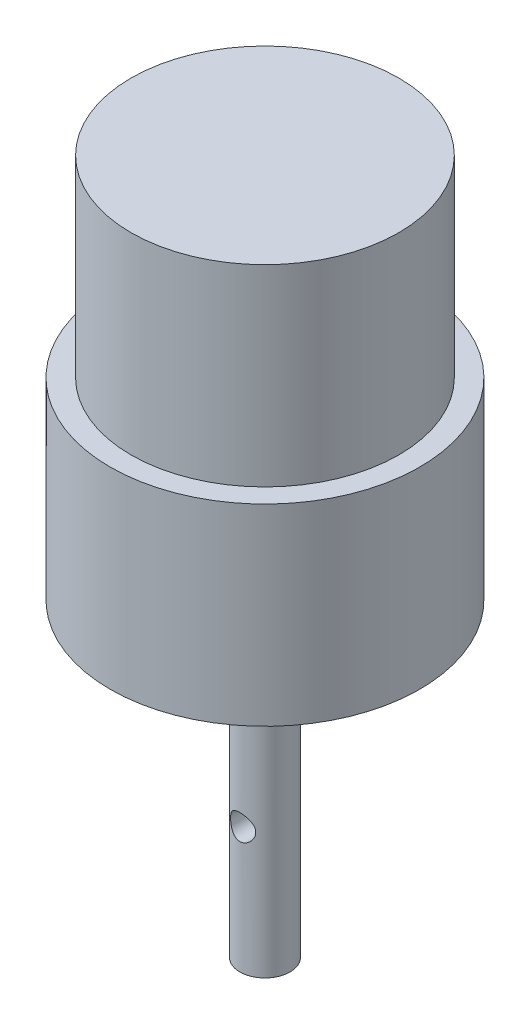
ISO-10303-21;
HEADER;
FILE_DESCRIPTION(('STEP AP214'),'2;1');
FILE_NAME('part.step','',(''),(''),'','','');
FILE_SCHEMA(('AUTOMOTIVE_DESIGN { 1 0 10303 214 1 1 1 1 }'));
ENDSEC;
DATA;
#1=APPLICATION_CONTEXT('core data for automotive mechanical design processes');
#2=APPLICATION_PROTOCOL_DEFINITION('international standard','automotive_design',2000,#1);
#3=PRODUCT_CONTEXT('',#1,'mechanical');
#4=PRODUCT('Part','Part','',(#3));
#5=PRODUCT_RELATED_PRODUCT_CATEGORY('part','',(#4));
#6=PRODUCT_DEFINITION_FORMATION('','',#4);
#7=PRODUCT_DEFINITION_CONTEXT('part definition',#1,'design');
#8=PRODUCT_DEFINITION('design','',#6,#7);
#9=PRODUCT_DEFINITION_SHAPE('','',#8);
#10=(LENGTH_UNIT() NAMED_UNIT(*) SI_UNIT(.MILLI.,.METRE.));
#11=(NAMED_UNIT(*) PLANE_ANGLE_UNIT() SI_UNIT($,.RADIAN.));
#12=(NAMED_UNIT(*) SI_UNIT($,.STERADIAN.) SOLID_ANGLE_UNIT());
#13=UNCERTAINTY_MEASURE_WITH_UNIT(LENGTH_MEASURE(1.E-05),#10,'distance_accuracy_value','');
#14=(GEOMETRIC_REPRESENTATION_CONTEXT(3) GLOBAL_UNCERTAINTY_ASSIGNED_CONTEXT((#13)) GLOBAL_UNIT_ASSIGNED_CONTEXT((#10,
#11,#12)) REPRESENTATION_CONTEXT('',''));
#15=CARTESIAN_POINT('',(0.,0.,0.));
#16=DIRECTION('',(0.,0.,1.));
#17=DIRECTION('',(1.,0.,0.));
#18=AXIS2_PLACEMENT_3D('',#15,#16,#17);
#19=CARTESIAN_POINT('',(0.,-37.,0.));
#20=DIRECTION('',(0.,1.,0.));
#21=DIRECTION('',(0.,0.,1.));
#22=AXIS2_PLACEMENT_3D('',#19,#20,#21);
#23=CYLINDRICAL_SURFACE('',#22,3.);
#24=CARTESIAN_POINT('',(-1.5,-22.,-2.59807621135332));
#25=CARTESIAN_POINT('',(-1.4999945446118,-22.0781617122929,-2.59808302092689));
#26=CARTESIAN_POINT('',(-1.49384995609983,-22.1564221172876,-2.60165701781635));
#27=CARTESIAN_POINT('',(-1.46958481484708,-22.3105408970157,-2.61543549678078));
#28=CARTESIAN_POINT('',(-1.45143909683127,-22.3863938725651,-2.62565391083339));
#29=CARTESIAN_POINT('',(-1.40414992304972,-22.5331774965159,-2.65124019908097));
#30=CARTESIAN_POINT('',(-1.3750649287406,-22.6041319787104,-2.66658065209878));
#31=CARTESIAN_POINT('',(-1.30690128806456,-22.7401363029951,-2.70063997225287));
#32=CARTESIAN_POINT('',(-1.26782210105366,-22.8051858253937,-2.71935902214097));
#33=CARTESIAN_POINT('',(-1.17699981079632,-22.9334585928363,-2.75995303586162));
#34=CARTESIAN_POINT('',(-1.12447805421566,-22.9960887035103,-2.7819609545693));
#35=CARTESIAN_POINT('',(-1.0098807114217,-23.1121125826101,-2.82557974178558));
#36=CARTESIAN_POINT('',(-0.947800388673441,-23.1655017438753,-2.84719040746875));
#37=CARTESIAN_POINT('',(-0.81073434512182,-23.2650507267215,-2.88932215429423));
#38=CARTESIAN_POINT('',(-0.735160783518862,-23.3104806517893,-2.90967159627259));
#39=CARTESIAN_POINT('',(-0.576235539899256,-23.3877112798686,-2.94526134149293));
#40=CARTESIAN_POINT('',(-0.492888807207233,-23.4195205842058,-2.96050486775612));
#41=CARTESIAN_POINT('',(-0.327067415888966,-23.4662569919516,-2.98320691866356));
#42=CARTESIAN_POINT('',(-0.244952685733226,-23.4822242895333,-2.99114220331338));
#43=CARTESIAN_POINT('',(-0.078855943046772,-23.5002491780126,-3.000113757691));
#44=CARTESIAN_POINT('',(0.00512490876560793,-23.5023151851936,-3.00115420176885));
#45=CARTESIAN_POINT('',(0.164748786635625,-23.4928799890445,-2.99644472874675));
#46=CARTESIAN_POINT('',(0.240481798765187,-23.4825429767182,-2.99127743838241));
#47=CARTESIAN_POINT('',(0.388970657877482,-23.450678734143,-2.97561367889621));
#48=CARTESIAN_POINT('',(0.461726281640888,-23.4291506665357,-2.96511681099591));
#49=CARTESIAN_POINT('',(0.603464087354331,-23.3753761508653,-2.93957374931482));
#50=CARTESIAN_POINT('',(0.672380135272769,-23.3429855302419,-2.92446662293799));
#51=CARTESIAN_POINT('',(0.803965202269994,-23.2686048756978,-2.89106468980031));
#52=CARTESIAN_POINT('',(0.866631973257969,-23.2266114050465,-2.87276874236226));
#53=CARTESIAN_POINT('',(0.990260491347293,-23.1296569727005,-2.83266591598844));
#54=CARTESIAN_POINT('',(1.05050111254404,-23.073845457511,-2.81069063997263));
#55=CARTESIAN_POINT('',(1.16115655544667,-22.9531154126047,-2.76681510880217));
#56=CARTESIAN_POINT('',(1.21156381736135,-22.8881899415889,-2.74491492398443));
#57=CARTESIAN_POINT('',(1.30425800196332,-22.7460277113639,-2.70216234138727));
#58=CARTESIAN_POINT('',(1.34582597246708,-22.6682709654187,-2.68146479986061));
#59=CARTESIAN_POINT('',(1.41497866950185,-22.5055934929615,-2.64563175417864));
#60=CARTESIAN_POINT('',(1.44257798731634,-22.4206803504737,-2.63049045069101));
#61=CARTESIAN_POINT('',(1.48077031653756,-22.2531782330758,-2.60916953725551));
#62=CARTESIAN_POINT('',(1.49253768317996,-22.1709383214347,-2.60237483772744));
#63=CARTESIAN_POINT('',(1.50227541991714,-22.0053979877252,-2.59676879042414));
#64=CARTESIAN_POINT('',(1.50025553597254,-21.9220983563203,-2.59795180333967));
#65=CARTESIAN_POINT('',(1.48355406501595,-21.7665191221319,-2.60751504810877));
#66=CARTESIAN_POINT('',(1.4702817250687,-21.6940308233381,-2.61509381259981));
#67=CARTESIAN_POINT('',(1.43354442694866,-21.5524483205936,-2.63541032327011));
#68=CARTESIAN_POINT('',(1.41007616793542,-21.4833552238801,-2.6481497400755));
#69=CARTESIAN_POINT('',(1.35247138290733,-21.346883003646,-2.67804333119485));
#70=CARTESIAN_POINT('',(1.31789109553909,-21.2797314747197,-2.69537464864595));
#71=CARTESIAN_POINT('',(1.23943059602371,-21.1517960926915,-2.73234179245874));
#72=CARTESIAN_POINT('',(1.19554560649833,-21.0910155347301,-2.75197880032721));
#73=CARTESIAN_POINT('',(1.09325575079828,-20.9695318487147,-2.79431997684504));
#74=CARTESIAN_POINT('',(1.03371790847245,-20.9098042739235,-2.81709874731433));
#75=CARTESIAN_POINT('',(0.905106743097437,-20.8008816430096,-2.86101352466838));
#76=CARTESIAN_POINT('',(0.836030211983024,-20.7516901446542,-2.88214897511564));
#77=CARTESIAN_POINT('',(0.687803043838138,-20.6641394110748,-2.92112042536435));
#78=CARTESIAN_POINT('',(0.608434646361172,-20.6261003226836,-2.93885462508044));
#79=CARTESIAN_POINT('',(0.443283546961624,-20.5642931442139,-2.96825032438951));
#80=CARTESIAN_POINT('',(0.357506552088264,-20.5405125229505,-2.97991715514559));
#81=CARTESIAN_POINT('',(0.190469523495625,-20.509947153738,-2.99501262272824));
#82=CARTESIAN_POINT('',(0.109517165775685,-20.5018031861858,-2.99909891862287));
#83=CARTESIAN_POINT('',(-0.0526889789268059,-20.4987351018184,-3.00063195562697));
#84=CARTESIAN_POINT('',(-0.133942650442631,-20.5038063572147,-2.99808102100335));
#85=CARTESIAN_POINT('',(-0.288806988475721,-20.5261246101934,-2.98700953256884));
#86=CARTESIAN_POINT('',(-0.362568476716895,-20.5425472738865,-2.97889342001985));
#87=CARTESIAN_POINT('',(-0.506168928275426,-20.5859904989545,-2.95788140495135));
#88=CARTESIAN_POINT('',(-0.576007327433263,-20.6130125801402,-2.94498481699193));
#89=CARTESIAN_POINT('',(-0.713135109367328,-20.678090578249,-2.9148889612218));
#90=CARTESIAN_POINT('',(-0.780187714050071,-20.7165689848118,-2.89752925798198));
#91=CARTESIAN_POINT('',(-0.907161962721039,-20.8029368962886,-2.86032199712739));
#92=CARTESIAN_POINT('',(-0.967080311122361,-20.8508307236735,-2.84047329837541));
#93=CARTESIAN_POINT('',(-1.08437100623534,-20.9601957085341,-2.79792915339941));
#94=CARTESIAN_POINT('',(-1.14089652680891,-21.0225437312158,-2.77514698517547));
#95=CARTESIAN_POINT('',(-1.24299493109201,-21.1561760816947,-2.73094614244278));
#96=CARTESIAN_POINT('',(-1.28855812501509,-21.2274682313015,-2.70952868642798));
#97=CARTESIAN_POINT('',(-1.36864661967848,-21.3799549698714,-2.66999407957374));
#98=CARTESIAN_POINT('',(-1.40277759894141,-21.4613912966931,-2.65200261384405));
#99=CARTESIAN_POINT('',(-1.45631806425962,-21.6299986065097,-2.62299234492527));
#100=CARTESIAN_POINT('',(-1.47577678676302,-21.717149333369,-2.61195024221553));
#101=CARTESIAN_POINT('',(-1.49155051179662,-21.837708033478,-2.60293908902686));
#102=CARTESIAN_POINT('',(-1.49471415744578,-21.8700518415968,-2.60112193507727));
#103=CARTESIAN_POINT('',(-1.49894010763495,-21.9349247210234,-2.59868903831625));
#104=CARTESIAN_POINT('',(-1.50000227159981,-21.9674538045788,-2.59807337587664));
#105=CARTESIAN_POINT('',(-1.5,-22.,-2.59807621135332));
#106=B_SPLINE_CURVE_WITH_KNOTS('',3,(#24,#25,#26,#27,#28,#29,#30,#31,#32,#33,#34,#35,#36,#37,
#38,#39,#40,#41,#42,#43,#44,#45,#46,#47,#48,#49,#50,#51,#52,#53,#54,#55,#56,#57,#58,#59,#60,#61,
#62,#63,#64,#65,#66,#67,#68,#69,#70,#71,#72,#73,#74,#75,#76,#77,#78,#79,#80,#81,#82,#83,#84,#85,
#86,#87,#88,#89,#90,#91,#92,#93,#94,#95,#96,#97,#98,#99,#100,#101,#102,#103,#104,#105),
.UNSPECIFIED.,.T.,.F.,(4,2,2,2,2,2,2,2,2,2,2,2,2,2,2,2,2,2,2,2,2,2,2,2,2,2,2,2,2,2,2,2,2,2,2,2,
2,2,2,2,4),(0.,0.234348183892075,0.469189339237207,0.702792893878324,0.936409088167727,
1.18929346874735,1.44230356626557,1.71236838358145,1.98226240445837,2.23295227451903,
2.4834903552906,2.71224146226808,2.94100968776183,3.1729430209672,3.40495949025408,
3.65890787185336,3.91305072368878,4.18333262594173,4.45333161317557,4.70193436281318,
4.9503613978256,5.17161275136038,5.39293578654095,5.62450944609132,5.85620229330071,
6.1171011537092,6.37808797467304,6.64596272119449,6.91360169713158,7.15668405584231,
7.39968130190958,7.62666637307239,7.8536840026802,8.09041126079209,8.32724745151079,
8.58765362775102,8.84828914267732,9.11716123557908,9.38512699504141,9.48270202777965,
9.58028358741812),.UNSPECIFIED.);
#107=CARTESIAN_POINT('',(-1.5,-22.,-2.59807621135332));
#108=VERTEX_POINT('',#107);
#109=EDGE_CURVE('E55',#108,#108,#106,.T.);
#110=ORIENTED_EDGE('',*,*,#109,.T.);
#111=EDGE_LOOP('',(#110));
#112=FACE_BOUND('',#111,.T.);
#113=CARTESIAN_POINT('',(0.,-8.,0.));
#114=DIRECTION('',(0.,-1.,0.));
#115=DIRECTION('',(0.,0.,-1.));
#116=AXIS2_PLACEMENT_3D('',#113,#114,#115);
#117=CIRCLE('',#116,3.);
#118=CARTESIAN_POINT('',(0.,-8.,-3.));
#119=VERTEX_POINT('',#118);
#120=EDGE_CURVE('E10',#119,#119,#117,.T.);
#121=ORIENTED_EDGE('',*,*,#120,.T.);
#122=EDGE_LOOP('',(#121));
#123=FACE_BOUND('',#122,.T.);
#124=CARTESIAN_POINT('',(0.,-37.,0.));
#125=DIRECTION('',(0.,1.,0.));
#126=DIRECTION('',(0.,0.,1.));
#127=AXIS2_PLACEMENT_3D('',#124,#125,#126);
#128=CIRCLE('',#127,3.);
#129=CARTESIAN_POINT('',(0.,-37.,3.));
#130=VERTEX_POINT('',#129);
#131=EDGE_CURVE('E89',#130,#130,#128,.T.);
#132=ORIENTED_EDGE('',*,*,#131,.T.);
#133=EDGE_LOOP('',(#132));
#134=FACE_BOUND('',#133,.T.);
#135=CARTESIAN_POINT('',(0.,-23.5,3.));
#136=CARTESIAN_POINT('',(-0.0788579444268502,-23.4999950465242,2.99999570107562));
#137=CARTESIAN_POINT('',(-0.157809899546344,-23.4937448903184,2.99685736529634));
#138=CARTESIAN_POINT('',(-0.313380352903345,-23.4690206794877,2.98461234055735));
#139=CARTESIAN_POINT('',(-0.389994130070445,-23.4505234105033,2.97549431743379));
#140=CARTESIAN_POINT('',(-0.538400317320674,-23.4022092870751,2.95224419105063));
#141=CARTESIAN_POINT('',(-0.61021020440872,-23.372436423628,2.93813158766306));
#142=CARTESIAN_POINT('',(-0.747708925209898,-23.3026440679525,2.90618664773642));
#143=CARTESIAN_POINT('',(-0.813398240985089,-23.2626253836267,2.88835460450288));
#144=CARTESIAN_POINT('',(-0.941261726642864,-23.1707241257721,2.84934387387093));
#145=CARTESIAN_POINT('',(-1.00298281668316,-23.1182702811405,2.82802798691306));
#146=CARTESIAN_POINT('',(-1.11716916730047,-23.0042177811295,2.78489955370114));
#147=CARTESIAN_POINT('',(-1.16962737466015,-22.9426122223413,2.76308664313552));
#148=CARTESIAN_POINT('',(-1.26787800067542,-22.8062749757149,2.71948426796021));
#149=CARTESIAN_POINT('',(-1.31283800332746,-22.7308958524811,2.69782780455198));
#150=CARTESIAN_POINT('',(-1.38925234033605,-22.5724489960207,2.65928968158481));
#151=CARTESIAN_POINT('',(-1.4207163224495,-22.4893868069159,2.64240461410484));
#152=CARTESIAN_POINT('',(-1.46719866328288,-22.3230023418671,2.61686800556713));
#153=CARTESIAN_POINT('',(-1.48308878562066,-22.2399933218989,2.6077840737557));
#154=CARTESIAN_POINT('',(-1.50064048996327,-22.0720317433308,2.59772834922791));
#155=CARTESIAN_POINT('',(-1.50231613255961,-21.9870811886933,2.59674854014932));
#156=CARTESIAN_POINT('',(-1.49203093075844,-21.8285709635269,2.60266395385873));
#157=CARTESIAN_POINT('',(-1.48167683930523,-21.7548639531654,2.6086314549302));
#158=CARTESIAN_POINT('',(-1.4504097735854,-21.6104171359404,2.62614343100775));
#159=CARTESIAN_POINT('',(-1.42949343584648,-21.539678282042,2.63768968247664));
#160=CARTESIAN_POINT('',(-1.37731467057901,-21.4011563011515,2.66531214619111));
#161=CARTESIAN_POINT('',(-1.34582260067399,-21.3334804018213,2.68148760995998));
#162=CARTESIAN_POINT('',(-1.273562531502,-21.204048561115,2.71655106422105));
#163=CARTESIAN_POINT('',(-1.2327903657187,-21.1422952965999,2.73544027170286));
#164=CARTESIAN_POINT('',(-1.13709908236918,-21.0182181208852,2.77669736854929));
#165=CARTESIAN_POINT('',(-1.08104168755392,-20.9568146896358,2.79920265355119));
#166=CARTESIAN_POINT('',(-0.959333368112059,-20.8438968721136,2.84321434950611));
#167=CARTESIAN_POINT('',(-0.893677884861427,-20.7923872119492,2.86472027938201));
#168=CARTESIAN_POINT('',(-0.750774758747771,-20.6984715084554,2.90552980924446));
#169=CARTESIAN_POINT('',(-0.673130387399112,-20.6565992913314,2.92468476243011));
#170=CARTESIAN_POINT('',(-0.510699323233194,-20.5868544564355,2.95736821681863));
#171=CARTESIAN_POINT('',(-0.425918364397914,-20.5589707224773,2.9709011841533));
#172=CARTESIAN_POINT('',(-0.259149737491054,-20.520286894425,2.98986500612153));
#173=CARTESIAN_POINT('',(-0.17751229582249,-20.5082631463798,2.99587407451965));
#174=CARTESIAN_POINT('',(-0.0131693999240276,-20.4978029032983,3.00109520188655));
#175=CARTESIAN_POINT('',(0.0695355298048633,-20.4993599715408,3.00031048081978));
#176=CARTESIAN_POINT('',(0.226849457978981,-20.5153100326281,2.99236788380152));
#177=CARTESIAN_POINT('',(0.301589112074895,-20.528698799095,2.98570868532252));
#178=CARTESIAN_POINT('',(0.447610338452911,-20.5663571078427,2.9673325697226));
#179=CARTESIAN_POINT('',(0.518891528536631,-20.5906278496802,2.95561509501618));
#180=CARTESIAN_POINT('',(0.658332912674359,-20.6499976996495,2.92776377120382));
#181=CARTESIAN_POINT('',(0.726345595508705,-20.6853865751744,2.91151322654446));
#182=CARTESIAN_POINT('',(0.855692042548907,-20.7656613034699,2.87615961476126));
#183=CARTESIAN_POINT('',(0.917022944664888,-20.8105512018931,2.85705533350407));
#184=CARTESIAN_POINT('',(1.03765153393382,-20.9136406379961,2.81562332004297));
#185=CARTESIAN_POINT('',(1.09615811672854,-20.9727143026677,2.79316327265249));
#186=CARTESIAN_POINT('',(1.20278448167829,-21.0998877269166,2.7489358741323));
#187=CARTESIAN_POINT('',(1.25089707856781,-21.1679936782719,2.7271690110007));
#188=CARTESIAN_POINT('',(1.33756187171853,-21.3154654812595,2.68576788309734));
#189=CARTESIAN_POINT('',(1.37553824370037,-21.3952168991417,2.66628794383591));
#190=CARTESIAN_POINT('',(1.43712423890206,-21.5612651013624,2.63361108441202));
#191=CARTESIAN_POINT('',(1.46075237380053,-21.6475532897003,2.62040607332625));
#192=CARTESIAN_POINT('',(1.49079253120031,-21.8153653343271,2.60342251538703));
#193=CARTESIAN_POINT('',(1.49863949460818,-21.8965513801529,2.59886075197597));
#194=CARTESIAN_POINT('',(1.5010337315643,-22.0591706007468,2.59748031962405));
#195=CARTESIAN_POINT('',(1.49558676993486,-22.1406036531068,2.60065829439585));
#196=CARTESIAN_POINT('',(1.47288918838997,-22.2932252523002,2.61356793076615));
#197=CARTESIAN_POINT('',(1.45681247151455,-22.3646507052171,2.62264641723987));
#198=CARTESIAN_POINT('',(1.41476303733662,-22.5037121791366,2.64556524281479));
#199=CARTESIAN_POINT('',(1.38878713673988,-22.5713469731381,2.65940711354503));
#200=CARTESIAN_POINT('',(1.32572361795085,-22.7059372764798,2.69142795546803));
#201=CARTESIAN_POINT('',(1.28800670672355,-22.7725418527435,2.70983583593881));
#202=CARTESIAN_POINT('',(1.20322645745609,-22.8989118042719,2.7485299745229));
#203=CARTESIAN_POINT('',(1.15615825686234,-22.9586735957817,2.76881720693416));
#204=CARTESIAN_POINT('',(1.04730498999206,-23.077212973532,2.81193484737138));
#205=CARTESIAN_POINT('',(0.984426634495892,-23.1349886535254,2.83477474959942));
#206=CARTESIAN_POINT('',(0.849232209349796,-23.2393944751529,2.87816628389896));
#207=CARTESIAN_POINT('',(0.776911084957796,-23.2860186092049,2.89871667939293));
#208=CARTESIAN_POINT('',(0.623897395174418,-23.3668545440681,2.93547014349806));
#209=CARTESIAN_POINT('',(0.543149255665095,-23.4009762538547,2.95164144740899));
#210=CARTESIAN_POINT('',(0.376113151707129,-23.4547122516361,2.9775201194848));
#211=CARTESIAN_POINT('',(0.28984169938365,-23.4743677702086,2.98724585044602));
#212=CARTESIAN_POINT('',(0.168902919736343,-23.4908461166286,2.99543192870217));
#213=CARTESIAN_POINT('',(0.135242819162347,-23.4942739612995,2.99714048010376));
#214=CARTESIAN_POINT('',(0.0677275977076371,-23.4988519982711,2.99942545465223));
#215=CARTESIAN_POINT('',(0.0338724714699425,-23.5000021277053,3.00000184655071));
#216=CARTESIAN_POINT('',(0.,-23.5,3.));
#217=B_SPLINE_CURVE_WITH_KNOTS('',3,(#135,#136,#137,#138,#139,#140,#141,#142,#143,#144,#145,
#146,#147,#148,#149,#150,#151,#152,#153,#154,#155,#156,#157,#158,#159,#160,#161,#162,#163,#164,
#165,#166,#167,#168,#169,#170,#171,#172,#173,#174,#175,#176,#177,#178,#179,#180,#181,#182,#183,
#184,#185,#186,#187,#188,#189,#190,#191,#192,#193,#194,#195,#196,#197,#198,#199,#200,#201,#202,
#203,#204,#205,#206,#207,#208,#209,#210,#211,#212,#213,#214,#215,#216),.UNSPECIFIED.,.T.,.F.,(4,
2,2,2,2,2,2,2,2,2,2,2,2,2,2,2,2,2,2,2,2,2,2,2,2,2,2,2,2,2,2,2,2,2,2,2,2,2,2,2,4),(0.,
0.236436386130439,0.473322224563797,0.709293233238449,0.945245640872352,1.19547263807713,
1.44588935648105,1.7157258964613,1.98536921847422,2.23887018210344,2.49212035993531,
2.71508568613981,2.93812205888518,3.16635360252732,3.39468781890333,3.65197412000818,
3.9093830189803,4.17874533321662,4.4478932536842,4.69474935707019,4.94148846767215,
5.16910359759183,5.39674382446398,5.63089284041848,5.86514176122509,6.12239415966629,
6.37982382923148,6.64972023242589,6.91926767918177,7.1629396125457,7.40650589797018,
7.62686895373284,7.84730293182527,8.08254685170432,8.31791341715447,8.58187864135758,
8.84598575071869,9.11196020495291,9.37717362931724,9.47872920200876,9.580287577666),.UNSPECIFIED.);
#218=CARTESIAN_POINT('',(0.,-23.5,3.));
#219=VERTEX_POINT('',#218);
#220=EDGE_CURVE('E36',#219,#219,#217,.T.);
#221=ORIENTED_EDGE('',*,*,#220,.T.);
#222=EDGE_LOOP('',(#221));
#223=FACE_BOUND('',#222,.T.);
#224=ADVANCED_FACE('F32',(#112,#123,#134,#223),#23,.T.);
#225=CARTESIAN_POINT('',(0.,23.,0.));
#226=DIRECTION('',(0.,-1.,0.));
#227=DIRECTION('',(0.,0.,-1.));
#228=AXIS2_PLACEMENT_3D('',#225,#226,#227);
#229=CYLINDRICAL_SURFACE('',#228,18.5);
#230=CARTESIAN_POINT('',(0.,23.,0.));
#231=DIRECTION('',(0.,1.,0.));
#232=DIRECTION('',(0.,0.,1.));
#233=AXIS2_PLACEMENT_3D('',#230,#231,#232);
#234=CIRCLE('',#233,18.5);
#235=CARTESIAN_POINT('',(0.,23.,18.5));
#236=VERTEX_POINT('',#235);
#237=EDGE_CURVE('E101',#236,#236,#234,.T.);
#238=ORIENTED_EDGE('',*,*,#237,.F.);
#239=EDGE_LOOP('',(#238));
#240=FACE_BOUND('',#239,.T.);
#241=CARTESIAN_POINT('',(0.,0.,0.));
#242=DIRECTION('',(0.,1.,0.));
#243=DIRECTION('',(0.,0.,1.));
#244=AXIS2_PLACEMENT_3D('',#241,#242,#243);
#245=CIRCLE('',#244,18.5);
#246=CARTESIAN_POINT('',(0.,0.,18.5));
#247=VERTEX_POINT('',#246);
#248=EDGE_CURVE('E53',#247,#247,#245,.T.);
#249=ORIENTED_EDGE('',*,*,#248,.T.);
#250=EDGE_LOOP('',(#249));
#251=FACE_BOUND('',#250,.T.);
#252=ADVANCED_FACE('F34',(#240,#251),#229,.T.);
#253=CARTESIAN_POINT('',(0.,23.,0.));
#254=DIRECTION('',(0.,1.,0.));
#255=DIRECTION('',(0.,0.,1.));
#256=AXIS2_PLACEMENT_3D('',#253,#254,#255);
#257=PLANE('',#256);
#258=CARTESIAN_POINT('',(0.,23.,0.));
#259=DIRECTION('',(0.,1.,0.));
#260=DIRECTION('',(0.,0.,1.));
#261=AXIS2_PLACEMENT_3D('',#258,#259,#260);
#262=CIRCLE('',#261,16.);
#263=CARTESIAN_POINT('',(0.,23.,16.));
#264=VERTEX_POINT('',#263);
#265=EDGE_CURVE('E50',#264,#264,#262,.T.);
#266=ORIENTED_EDGE('',*,*,#265,.F.);
#267=EDGE_LOOP('',(#266));
#268=FACE_BOUND('',#267,.T.);
#269=ORIENTED_EDGE('',*,*,#237,.T.);
#270=EDGE_LOOP('',(#269));
#271=FACE_BOUND('',#270,.T.);
#272=ADVANCED_FACE('F83',(#268,#271),#257,.T.);
#273=CARTESIAN_POINT('',(0.,0.,0.));
#274=DIRECTION('',(0.,1.,0.));
#275=DIRECTION('',(0.,0.,1.));
#276=AXIS2_PLACEMENT_3D('',#273,#274,#275);
#277=PLANE('',#276);
#278=CARTESIAN_POINT('',(0.,0.,0.));
#279=DIRECTION('',(0.,-1.,0.));
#280=DIRECTION('',(0.,0.,-1.));
#281=AXIS2_PLACEMENT_3D('',#278,#279,#280);
#282=CIRCLE('',#281,7.);
#283=CARTESIAN_POINT('',(0.,0.,-7.));
#284=VERTEX_POINT('',#283);
#285=EDGE_CURVE('E45',#284,#284,#282,.T.);
#286=ORIENTED_EDGE('',*,*,#285,.F.);
#287=EDGE_LOOP('',(#286));
#288=FACE_BOUND('',#287,.T.);
#289=ORIENTED_EDGE('',*,*,#248,.F.);
#290=EDGE_LOOP('',(#289));
#291=FACE_BOUND('',#290,.T.);
#292=ADVANCED_FACE('F109',(#288,#291),#277,.F.);
#293=CARTESIAN_POINT('',(0.,46.,0.));
#294=DIRECTION('',(0.,-1.,0.));
#295=DIRECTION('',(0.,0.,-1.));
#296=AXIS2_PLACEMENT_3D('',#293,#294,#295);
#297=CYLINDRICAL_SURFACE('',#296,16.);
#298=CARTESIAN_POINT('',(0.,46.,0.));
#299=DIRECTION('',(0.,1.,0.));
#300=DIRECTION('',(0.,0.,1.));
#301=AXIS2_PLACEMENT_3D('',#298,#299,#300);
#302=CIRCLE('',#301,16.);
#303=CARTESIAN_POINT('',(0.,46.,16.));
#304=VERTEX_POINT('',#303);
#305=EDGE_CURVE('E95',#304,#304,#302,.T.);
#306=ORIENTED_EDGE('',*,*,#305,.F.);
#307=EDGE_LOOP('',(#306));
#308=FACE_BOUND('',#307,.T.);
#309=ORIENTED_EDGE('',*,*,#265,.T.);
#310=EDGE_LOOP('',(#309));
#311=FACE_BOUND('',#310,.T.);
#312=ADVANCED_FACE('F111',(#308,#311),#297,.T.);
#313=CARTESIAN_POINT('',(0.,46.,0.));
#314=DIRECTION('',(0.,1.,0.));
#315=DIRECTION('',(0.,0.,1.));
#316=AXIS2_PLACEMENT_3D('',#313,#314,#315);
#317=PLANE('',#316);
#318=ORIENTED_EDGE('',*,*,#305,.T.);
#319=EDGE_LOOP('',(#318));
#320=FACE_BOUND('',#319,.T.);
#321=ADVANCED_FACE('F117',(#320),#317,.T.);
#322=CARTESIAN_POINT('',(0.,-8.,0.));
#323=DIRECTION('',(0.,1.,0.));
#324=DIRECTION('',(0.,0.,1.));
#325=AXIS2_PLACEMENT_3D('',#322,#323,#324);
#326=CYLINDRICAL_SURFACE('',#325,7.);
#327=CARTESIAN_POINT('',(0.,-8.,0.));
#328=DIRECTION('',(0.,-1.,0.));
#329=DIRECTION('',(0.,0.,-1.));
#330=AXIS2_PLACEMENT_3D('',#327,#328,#329);
#331=CIRCLE('',#330,7.);
#332=CARTESIAN_POINT('',(0.,-8.,-7.));
#333=VERTEX_POINT('',#332);
#334=EDGE_CURVE('E92',#333,#333,#331,.T.);
#335=ORIENTED_EDGE('',*,*,#334,.F.);
#336=EDGE_LOOP('',(#335));
#337=FACE_BOUND('',#336,.T.);
#338=ORIENTED_EDGE('',*,*,#285,.T.);
#339=EDGE_LOOP('',(#338));
#340=FACE_BOUND('',#339,.T.);
#341=ADVANCED_FACE('F75',(#337,#340),#326,.T.);
#342=CARTESIAN_POINT('',(0.,-8.,0.));
#343=DIRECTION('',(0.,-1.,0.));
#344=DIRECTION('',(0.,0.,-1.));
#345=AXIS2_PLACEMENT_3D('',#342,#343,#344);
#346=PLANE('',#345);
#347=ORIENTED_EDGE('',*,*,#120,.F.);
#348=EDGE_LOOP('',(#347));
#349=FACE_BOUND('',#348,.T.);
#350=ORIENTED_EDGE('',*,*,#334,.T.);
#351=EDGE_LOOP('',(#350));
#352=FACE_BOUND('',#351,.T.);
#353=ADVANCED_FACE('F70',(#349,#352),#346,.T.);
#354=CARTESIAN_POINT('',(0.,-37.,0.));
#355=DIRECTION('',(0.,1.,0.));
#356=DIRECTION('',(0.,0.,1.));
#357=AXIS2_PLACEMENT_3D('',#354,#355,#356);
#358=PLANE('',#357);
#359=ORIENTED_EDGE('',*,*,#131,.F.);
#360=EDGE_LOOP('',(#359));
#361=FACE_BOUND('',#360,.T.);
#362=ADVANCED_FACE('F66',(#361),#358,.F.);
#363=CARTESIAN_POINT('',(0.,-22.,10.));
#364=DIRECTION('',(0.,0.,-1.));
#365=DIRECTION('',(-1.,0.,0.));
#366=AXIS2_PLACEMENT_3D('',#363,#364,#365);
#367=CYLINDRICAL_SURFACE('',#366,1.5);
#368=ORIENTED_EDGE('',*,*,#220,.F.);
#369=EDGE_LOOP('',(#368));
#370=FACE_BOUND('',#369,.T.);
#371=ORIENTED_EDGE('',*,*,#109,.F.);
#372=EDGE_LOOP('',(#371));
#373=FACE_BOUND('',#372,.T.);
#374=ADVANCED_FACE('F63',(#370,#373),#367,.F.);
#375=CLOSED_SHELL('',(#224,#252,#272,#292,#312,#321,#341,#353,#362,#374));
#376=MANIFOLD_SOLID_BREP('B2',#375);
#377=ADVANCED_BREP_SHAPE_REPRESENTATION('',(#18,#376),#14);
#378=SHAPE_DEFINITION_REPRESENTATION(#9,#377);
ENDSEC;
END-ISO-10303-21;
